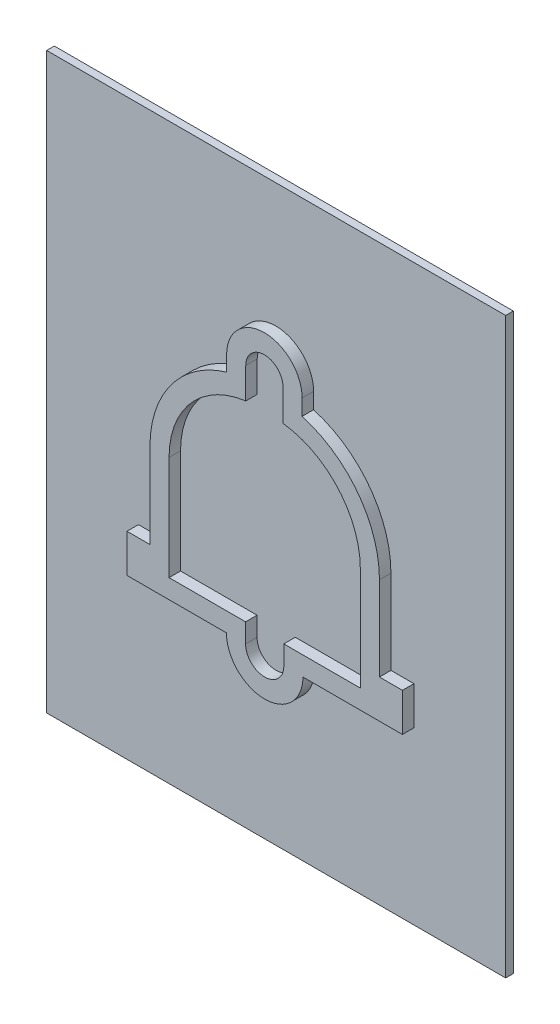
ISO-10303-21;
HEADER;
FILE_DESCRIPTION(('STEP AP214'),'2;1');
FILE_NAME('part.step','',(''),(''),'','','');
FILE_SCHEMA(('AUTOMOTIVE_DESIGN { 1 0 10303 214 1 1 1 1 }'));
ENDSEC;
DATA;
#1=APPLICATION_CONTEXT('core data for automotive mechanical design processes');
#2=APPLICATION_PROTOCOL_DEFINITION('international standard','automotive_design',2000,#1);
#3=PRODUCT_CONTEXT('',#1,'mechanical');
#4=PRODUCT('Part','Part','',(#3));
#5=PRODUCT_RELATED_PRODUCT_CATEGORY('part','',(#4));
#6=PRODUCT_DEFINITION_FORMATION('','',#4);
#7=PRODUCT_DEFINITION_CONTEXT('part definition',#1,'design');
#8=PRODUCT_DEFINITION('design','',#6,#7);
#9=PRODUCT_DEFINITION_SHAPE('','',#8);
#10=(LENGTH_UNIT() NAMED_UNIT(*) SI_UNIT(.MILLI.,.METRE.));
#11=(NAMED_UNIT(*) PLANE_ANGLE_UNIT() SI_UNIT($,.RADIAN.));
#12=(NAMED_UNIT(*) SI_UNIT($,.STERADIAN.) SOLID_ANGLE_UNIT());
#13=UNCERTAINTY_MEASURE_WITH_UNIT(LENGTH_MEASURE(1.E-05),#10,'distance_accuracy_value','');
#14=(GEOMETRIC_REPRESENTATION_CONTEXT(3) GLOBAL_UNCERTAINTY_ASSIGNED_CONTEXT((#13)) GLOBAL_UNIT_ASSIGNED_CONTEXT((#10,
#11,#12)) REPRESENTATION_CONTEXT('',''));
#15=CARTESIAN_POINT('',(0.,0.,0.));
#16=DIRECTION('',(0.,0.,1.));
#17=DIRECTION('',(1.,0.,0.));
#18=AXIS2_PLACEMENT_3D('',#15,#16,#17);
#19=CARTESIAN_POINT('',(-14.0104058623446,22.3529420123859,0.3));
#20=DIRECTION('',(0.,0.,-1.));
#21=DIRECTION('',(-1.,0.,0.));
#22=AXIS2_PLACEMENT_3D('',#19,#20,#21);
#23=PLANE('',#22);
#24=CARTESIAN_POINT('',(-14.0104058623446,22.3529420123859,0.3));
#25=DIRECTION('',(0.,0.,1.));
#26=DIRECTION('',(-1.,0.,0.));
#27=AXIS2_PLACEMENT_3D('',#24,#25,#26);
#28=CIRCLE('',#27,2.79999999999993);
#29=CARTESIAN_POINT('',(-14.8059769852625,25.0375400434473,0.3));
#30=VERTEX_POINT('',#29);
#31=CARTESIAN_POINT('',(-16.8104058623445,22.3529420123859,0.3));
#32=VERTEX_POINT('',#31);
#33=EDGE_CURVE('E57',#30,#32,#28,.T.);
#34=ORIENTED_EDGE('',*,*,#33,.T.);
#35=DIRECTION('',(0.,-1.,0.));
#36=VECTOR('',#35,1.);
#37=CARTESIAN_POINT('',(-16.8104058623445,22.3529420123859,0.3));
#38=LINE('',#37,#36);
#39=CARTESIAN_POINT('',(-16.8104058623445,20.131551421546,0.3));
#40=VERTEX_POINT('',#39);
#41=EDGE_CURVE('E403',#32,#40,#38,.T.);
#42=ORIENTED_EDGE('',*,*,#41,.T.);
#43=DIRECTION('',(-1.,0.,0.));
#44=VECTOR('',#43,1.);
#45=CARTESIAN_POINT('',(-16.8104058623445,20.131551421546,0.3));
#46=LINE('',#45,#44);
#47=CARTESIAN_POINT('',(-17.4104058623447,20.131551421546,0.3));
#48=VERTEX_POINT('',#47);
#49=EDGE_CURVE('E405',#40,#48,#46,.T.);
#50=ORIENTED_EDGE('',*,*,#49,.T.);
#51=DIRECTION('',(0.,-1.,0.));
#52=VECTOR('',#51,1.);
#53=CARTESIAN_POINT('',(-17.4104058623447,19.1315514215447,0.3));
#54=LINE('',#53,#52);
#55=CARTESIAN_POINT('',(-17.4104058623447,19.1315514215447,0.3));
#56=VERTEX_POINT('',#55);
#57=EDGE_CURVE('E407',#48,#56,#54,.T.);
#58=ORIENTED_EDGE('',*,*,#57,.T.);
#59=DIRECTION('',(1.,0.,0.));
#60=VECTOR('',#59,1.);
#61=CARTESIAN_POINT('',(-14.8104058623444,19.1315514215447,0.3));
#62=LINE('',#61,#60);
#63=CARTESIAN_POINT('',(-14.8104058623445,19.1315514215447,0.3));
#64=VERTEX_POINT('',#63);
#65=EDGE_CURVE('E409',#56,#64,#62,.T.);
#66=ORIENTED_EDGE('',*,*,#65,.T.);
#67=CARTESIAN_POINT('',(-13.8104058623445,19.1315514215446,0.3));
#68=DIRECTION('',(0.,0.,1.));
#69=DIRECTION('',(-1.,0.,0.));
#70=AXIS2_PLACEMENT_3D('',#67,#68,#69);
#71=CIRCLE('',#70,0.999999999999999);
#72=CARTESIAN_POINT('',(-12.8104058623444,19.1315514215453,0.3));
#73=VERTEX_POINT('',#72);
#74=EDGE_CURVE('E411',#64,#73,#71,.T.);
#75=ORIENTED_EDGE('',*,*,#74,.T.);
#76=DIRECTION('',(1.,0.,0.));
#77=VECTOR('',#76,1.);
#78=CARTESIAN_POINT('',(-10.2104058623447,19.1315514215453,0.3));
#79=LINE('',#78,#77);
#80=CARTESIAN_POINT('',(-10.2104058623447,19.1315514215453,0.3));
#81=VERTEX_POINT('',#80);
#82=EDGE_CURVE('E413',#73,#81,#79,.T.);
#83=ORIENTED_EDGE('',*,*,#82,.T.);
#84=DIRECTION('',(0.,1.,0.));
#85=VECTOR('',#84,1.);
#86=CARTESIAN_POINT('',(-10.2104058623447,19.1315514215453,0.3));
#87=LINE('',#86,#85);
#88=CARTESIAN_POINT('',(-10.2104058623447,20.131551421546,0.3));
#89=VERTEX_POINT('',#88);
#90=EDGE_CURVE('E415',#81,#89,#87,.T.);
#91=ORIENTED_EDGE('',*,*,#90,.T.);
#92=DIRECTION('',(-1.,1.27213054905061E-13,0.));
#93=VECTOR('',#92,1.);
#94=CARTESIAN_POINT('',(-10.2104058623447,20.131551421546,0.3));
#95=LINE('',#94,#93);
#96=CARTESIAN_POINT('',(-10.8104058623443,20.1315514215461,0.3));
#97=VERTEX_POINT('',#96);
#98=EDGE_CURVE('E417',#89,#97,#95,.T.);
#99=ORIENTED_EDGE('',*,*,#98,.T.);
#100=DIRECTION('',(0.,1.,0.));
#101=VECTOR('',#100,1.);
#102=CARTESIAN_POINT('',(-10.8104058623443,22.3315514215446,0.3));
#103=LINE('',#102,#101);
#104=CARTESIAN_POINT('',(-10.8104058623443,22.3315514215446,0.3));
#105=VERTEX_POINT('',#104);
#106=EDGE_CURVE('E419',#97,#105,#103,.T.);
#107=ORIENTED_EDGE('',*,*,#106,.T.);
#108=CARTESIAN_POINT('',(-13.6104058623441,22.3315514215446,0.3));
#109=DIRECTION('',(0.,0.,1.));
#110=DIRECTION('',(1.,0.,0.));
#111=AXIS2_PLACEMENT_3D('',#108,#109,#110);
#112=CIRCLE('',#111,2.79999999999987);
#113=CARTESIAN_POINT('',(-12.8328418132162,25.0214202193678,0.3));
#114=VERTEX_POINT('',#113);
#115=EDGE_CURVE('E421',#105,#114,#112,.T.);
#116=ORIENTED_EDGE('',*,*,#115,.T.);
#117=DIRECTION('',(0.,1.,0.));
#118=VECTOR('',#117,1.);
#119=CARTESIAN_POINT('',(-12.8328418132162,25.0214202193678,0.3));
#120=LINE('',#119,#118);
#121=CARTESIAN_POINT('',(-12.8328418132162,25.4375400434473,0.3));
#122=VERTEX_POINT('',#121);
#123=EDGE_CURVE('E423',#114,#122,#120,.T.);
#124=ORIENTED_EDGE('',*,*,#123,.T.);
#125=CARTESIAN_POINT('',(-13.8194093992394,25.4375400434473,0.3));
#126=DIRECTION('',(0.,0.,1.));
#127=DIRECTION('',(-1.,0.,0.));
#128=AXIS2_PLACEMENT_3D('',#125,#126,#127);
#129=CIRCLE('',#128,0.986567586023153);
#130=CARTESIAN_POINT('',(-14.8059769852625,25.4375400434473,0.3));
#131=VERTEX_POINT('',#130);
#132=EDGE_CURVE('E425',#122,#131,#129,.T.);
#133=ORIENTED_EDGE('',*,*,#132,.T.);
#134=DIRECTION('',(0.,-1.,0.));
#135=VECTOR('',#134,1.);
#136=CARTESIAN_POINT('',(-14.8059769852625,25.0375400434473,0.3));
#137=LINE('',#136,#135);
#138=EDGE_CURVE('E427',#131,#30,#137,.T.);
#139=ORIENTED_EDGE('',*,*,#138,.T.);
#140=EDGE_LOOP('',(#34,#42,#50,#58,#66,#75,#83,#91,#99,#107,#116,#124,#133,#139));
#141=FACE_BOUND('',#140,.T.);
#142=CARTESIAN_POINT('',(-13.6104058623441,22.3315514215446,0.3));
#143=DIRECTION('',(0.,0.,1.));
#144=DIRECTION('',(1.,0.,0.));
#145=AXIS2_PLACEMENT_3D('',#142,#143,#144);
#146=CIRCLE('',#145,2.29999999999994);
#147=CARTESIAN_POINT('',(-11.3104058623442,22.3315514215446,0.3));
#148=VERTEX_POINT('',#147);
#149=CARTESIAN_POINT('',(-13.3328418132162,24.6147417768657,0.3));
#150=VERTEX_POINT('',#149);
#151=EDGE_CURVE('E311',#148,#150,#146,.T.);
#152=ORIENTED_EDGE('',*,*,#151,.F.);
#153=DIRECTION('',(0.,1.,0.));
#154=VECTOR('',#153,1.);
#155=CARTESIAN_POINT('',(-11.3104058623442,22.3315514215446,0.3));
#156=LINE('',#155,#154);
#157=CARTESIAN_POINT('',(-11.3104058623442,19.6315514215453,0.3));
#158=VERTEX_POINT('',#157);
#159=EDGE_CURVE('E333',#158,#148,#156,.T.);
#160=ORIENTED_EDGE('',*,*,#159,.F.);
#161=DIRECTION('',(1.,0.,0.));
#162=VECTOR('',#161,1.);
#163=CARTESIAN_POINT('',(-11.3104058623442,19.6315514215453,0.3));
#164=LINE('',#163,#162);
#165=CARTESIAN_POINT('',(-13.3104058623445,19.6315514215453,0.3));
#166=VERTEX_POINT('',#165);
#167=EDGE_CURVE('E331',#166,#158,#164,.T.);
#168=ORIENTED_EDGE('',*,*,#167,.F.);
#169=DIRECTION('',(-2.25514051876647E-13,1.,0.));
#170=VECTOR('',#169,1.);
#171=CARTESIAN_POINT('',(-13.3104058623444,19.1315514215446,0.3));
#172=LINE('',#171,#170);
#173=CARTESIAN_POINT('',(-13.3104058623444,19.1315514215446,0.3));
#174=VERTEX_POINT('',#173);
#175=EDGE_CURVE('E329',#174,#166,#172,.T.);
#176=ORIENTED_EDGE('',*,*,#175,.F.);
#177=CARTESIAN_POINT('',(-13.8104058623445,19.1315514215446,0.3));
#178=DIRECTION('',(0.,0.,1.));
#179=DIRECTION('',(-1.,0.,0.));
#180=AXIS2_PLACEMENT_3D('',#177,#178,#179);
#181=CIRCLE('',#180,0.500000000000059);
#182=CARTESIAN_POINT('',(-14.3104058623446,19.1315514215446,0.3));
#183=VERTEX_POINT('',#182);
#184=EDGE_CURVE('E327',#183,#174,#181,.T.);
#185=ORIENTED_EDGE('',*,*,#184,.F.);
#186=DIRECTION('',(0.,-1.,0.));
#187=VECTOR('',#186,1.);
#188=CARTESIAN_POINT('',(-14.3104058623445,19.1315514215446,0.3));
#189=LINE('',#188,#187);
#190=CARTESIAN_POINT('',(-14.3104058623445,19.6315514215453,0.3));
#191=VERTEX_POINT('',#190);
#192=EDGE_CURVE('E325',#191,#183,#189,.T.);
#193=ORIENTED_EDGE('',*,*,#192,.F.);
#194=DIRECTION('',(1.,0.,0.));
#195=VECTOR('',#194,1.);
#196=CARTESIAN_POINT('',(-14.3104058623445,19.6315514215453,0.3));
#197=LINE('',#196,#195);
#198=CARTESIAN_POINT('',(-16.3104058623445,19.6315514215453,0.3));
#199=VERTEX_POINT('',#198);
#200=EDGE_CURVE('E323',#199,#191,#197,.T.);
#201=ORIENTED_EDGE('',*,*,#200,.F.);
#202=DIRECTION('',(0.,-1.,0.));
#203=VECTOR('',#202,1.);
#204=CARTESIAN_POINT('',(-16.3104058623445,22.3529420123859,0.3));
#205=LINE('',#204,#203);
#206=CARTESIAN_POINT('',(-16.3104058623445,22.3529420123859,0.3));
#207=VERTEX_POINT('',#206);
#208=EDGE_CURVE('E321',#207,#199,#205,.T.);
#209=ORIENTED_EDGE('',*,*,#208,.F.);
#210=CARTESIAN_POINT('',(-14.0104058623446,22.3529420123859,0.3));
#211=DIRECTION('',(0.,0.,1.));
#212=DIRECTION('',(-1.,0.,0.));
#213=AXIS2_PLACEMENT_3D('',#210,#211,#212);
#214=CIRCLE('',#213,2.29999999999995);
#215=CARTESIAN_POINT('',(-14.3059769852625,24.633871145721,0.3));
#216=VERTEX_POINT('',#215);
#217=EDGE_CURVE('E319',#216,#207,#214,.T.);
#218=ORIENTED_EDGE('',*,*,#217,.F.);
#219=DIRECTION('',(0.,-1.,0.));
#220=VECTOR('',#219,1.);
#221=CARTESIAN_POINT('',(-14.3059769852625,24.633871145721,0.3));
#222=LINE('',#221,#220);
#223=CARTESIAN_POINT('',(-14.3059769852625,25.4375400434473,0.3));
#224=VERTEX_POINT('',#223);
#225=EDGE_CURVE('E317',#224,#216,#222,.T.);
#226=ORIENTED_EDGE('',*,*,#225,.F.);
#227=CARTESIAN_POINT('',(-13.8194093992394,25.4375400434473,0.3));
#228=DIRECTION('',(0.,0.,1.));
#229=DIRECTION('',(-1.,0.,0.));
#230=AXIS2_PLACEMENT_3D('',#227,#228,#229);
#231=CIRCLE('',#230,0.486567586023158);
#232=CARTESIAN_POINT('',(-13.3328418132162,25.4375400434473,0.3));
#233=VERTEX_POINT('',#232);
#234=EDGE_CURVE('E315',#233,#224,#231,.T.);
#235=ORIENTED_EDGE('',*,*,#234,.F.);
#236=DIRECTION('',(0.,1.,0.));
#237=VECTOR('',#236,1.);
#238=CARTESIAN_POINT('',(-13.3328418132162,24.6147417768657,0.3));
#239=LINE('',#238,#237);
#240=EDGE_CURVE('E313',#150,#233,#239,.T.);
#241=ORIENTED_EDGE('',*,*,#240,.F.);
#242=EDGE_LOOP('',(#152,#160,#168,#176,#185,#193,#201,#209,#218,#226,#235,#241));
#243=FACE_BOUND('',#242,.T.);
#244=ADVANCED_FACE('F34',(#141,#243),#23,.F.);
#245=CARTESIAN_POINT('',(-16.8104058623445,22.3529420123859,0.3));
#246=DIRECTION('',(1.,0.,0.));
#247=DIRECTION('',(0.,1.,0.));
#248=AXIS2_PLACEMENT_3D('',#245,#246,#247);
#249=PLANE('',#248);
#250=DIRECTION('',(0.,-1.,0.));
#251=VECTOR('',#250,1.);
#252=CARTESIAN_POINT('',(-16.8104058623445,22.3529420123859,0.));
#253=LINE('',#252,#251);
#254=CARTESIAN_POINT('',(-16.8104058623445,22.3529420123859,0.));
#255=VERTEX_POINT('',#254);
#256=CARTESIAN_POINT('',(-16.8104058623445,20.131551421546,0.));
#257=VERTEX_POINT('',#256);
#258=EDGE_CURVE('E360',#255,#257,#253,.T.);
#259=ORIENTED_EDGE('',*,*,#258,.T.);
#260=DIRECTION('',(0.,0.,-1.));
#261=VECTOR('',#260,1.);
#262=CARTESIAN_POINT('',(-16.8104058623445,20.131551421546,0.3));
#263=LINE('',#262,#261);
#264=EDGE_CURVE('E42',#40,#257,#263,.T.);
#265=ORIENTED_EDGE('',*,*,#264,.F.);
#266=ORIENTED_EDGE('',*,*,#41,.F.);
#267=DIRECTION('',(0.,0.,-1.));
#268=VECTOR('',#267,1.);
#269=CARTESIAN_POINT('',(-16.8104058623445,22.3529420123859,0.3));
#270=LINE('',#269,#268);
#271=EDGE_CURVE('E11',#32,#255,#270,.T.);
#272=ORIENTED_EDGE('',*,*,#271,.T.);
#273=EDGE_LOOP('',(#259,#265,#266,#272));
#274=FACE_BOUND('',#273,.T.);
#275=ADVANCED_FACE('F36',(#274),#249,.F.);
#276=CARTESIAN_POINT('',(-16.8104058623445,20.131551421546,0.3));
#277=DIRECTION('',(0.,-1.,0.));
#278=DIRECTION('',(0.,0.,-1.));
#279=AXIS2_PLACEMENT_3D('',#276,#277,#278);
#280=PLANE('',#279);
#281=DIRECTION('',(-1.,0.,0.));
#282=VECTOR('',#281,1.);
#283=CARTESIAN_POINT('',(-16.8104058623445,20.131551421546,0.));
#284=LINE('',#283,#282);
#285=CARTESIAN_POINT('',(-17.4104058623447,20.131551421546,0.));
#286=VERTEX_POINT('',#285);
#287=EDGE_CURVE('E363',#257,#286,#284,.T.);
#288=ORIENTED_EDGE('',*,*,#287,.T.);
#289=DIRECTION('',(0.,0.,-1.));
#290=VECTOR('',#289,1.);
#291=CARTESIAN_POINT('',(-17.4104058623447,20.131551421546,0.3));
#292=LINE('',#291,#290);
#293=EDGE_CURVE('E461',#48,#286,#292,.T.);
#294=ORIENTED_EDGE('',*,*,#293,.F.);
#295=ORIENTED_EDGE('',*,*,#49,.F.);
#296=ORIENTED_EDGE('',*,*,#264,.T.);
#297=EDGE_LOOP('',(#288,#294,#295,#296));
#298=FACE_BOUND('',#297,.T.);
#299=ADVANCED_FACE('F467',(#298),#280,.F.);
#300=CARTESIAN_POINT('',(-17.4104058623447,19.1315514215447,0.3));
#301=DIRECTION('',(1.,0.,0.));
#302=DIRECTION('',(0.,0.,-1.));
#303=AXIS2_PLACEMENT_3D('',#300,#301,#302);
#304=PLANE('',#303);
#305=DIRECTION('',(0.,-1.,0.));
#306=VECTOR('',#305,1.);
#307=CARTESIAN_POINT('',(-17.4104058623447,19.1315514215447,0.));
#308=LINE('',#307,#306);
#309=CARTESIAN_POINT('',(-17.4104058623447,19.1315514215447,0.));
#310=VERTEX_POINT('',#309);
#311=EDGE_CURVE('E366',#286,#310,#308,.T.);
#312=ORIENTED_EDGE('',*,*,#311,.T.);
#313=DIRECTION('',(0.,0.,-1.));
#314=VECTOR('',#313,1.);
#315=CARTESIAN_POINT('',(-17.4104058623447,19.1315514215447,0.3));
#316=LINE('',#315,#314);
#317=EDGE_CURVE('E458',#56,#310,#316,.T.);
#318=ORIENTED_EDGE('',*,*,#317,.F.);
#319=ORIENTED_EDGE('',*,*,#57,.F.);
#320=ORIENTED_EDGE('',*,*,#293,.T.);
#321=EDGE_LOOP('',(#312,#318,#319,#320));
#322=FACE_BOUND('',#321,.T.);
#323=ADVANCED_FACE('F514',(#322),#304,.F.);
#324=CARTESIAN_POINT('',(-14.8104058623444,19.1315514215447,0.3));
#325=DIRECTION('',(0.,1.,0.));
#326=DIRECTION('',(0.,0.,1.));
#327=AXIS2_PLACEMENT_3D('',#324,#325,#326);
#328=PLANE('',#327);
#329=DIRECTION('',(1.,0.,0.));
#330=VECTOR('',#329,1.);
#331=CARTESIAN_POINT('',(-14.8104058623444,19.1315514215447,0.));
#332=LINE('',#331,#330);
#333=CARTESIAN_POINT('',(-14.8104058623445,19.1315514215447,0.));
#334=VERTEX_POINT('',#333);
#335=EDGE_CURVE('E369',#310,#334,#332,.T.);
#336=ORIENTED_EDGE('',*,*,#335,.T.);
#337=DIRECTION('',(0.,0.,-1.));
#338=VECTOR('',#337,1.);
#339=CARTESIAN_POINT('',(-14.8104058623445,19.1315514215447,0.3));
#340=LINE('',#339,#338);
#341=EDGE_CURVE('E455',#64,#334,#340,.T.);
#342=ORIENTED_EDGE('',*,*,#341,.F.);
#343=ORIENTED_EDGE('',*,*,#65,.F.);
#344=ORIENTED_EDGE('',*,*,#317,.T.);
#345=EDGE_LOOP('',(#336,#342,#343,#344));
#346=FACE_BOUND('',#345,.T.);
#347=ADVANCED_FACE('F509',(#346),#328,.F.);
#348=CARTESIAN_POINT('',(-13.8104058623445,19.1315514215446,0.3));
#349=DIRECTION('',(0.,0.,-1.));
#350=DIRECTION('',(-1.,0.,0.));
#351=AXIS2_PLACEMENT_3D('',#348,#349,#350);
#352=CYLINDRICAL_SURFACE('',#351,0.999999999999999);
#353=CARTESIAN_POINT('',(-13.8104058623445,19.1315514215446,0.));
#354=DIRECTION('',(0.,0.,1.));
#355=DIRECTION('',(-1.,0.,0.));
#356=AXIS2_PLACEMENT_3D('',#353,#354,#355);
#357=CIRCLE('',#356,0.999999999999999);
#358=CARTESIAN_POINT('',(-12.8104058623444,19.1315514215453,0.));
#359=VERTEX_POINT('',#358);
#360=EDGE_CURVE('E372',#334,#359,#357,.T.);
#361=ORIENTED_EDGE('',*,*,#360,.T.);
#362=DIRECTION('',(0.,0.,-1.));
#363=VECTOR('',#362,1.);
#364=CARTESIAN_POINT('',(-12.8104058623444,19.1315514215453,0.3));
#365=LINE('',#364,#363);
#366=EDGE_CURVE('E452',#73,#359,#365,.T.);
#367=ORIENTED_EDGE('',*,*,#366,.F.);
#368=ORIENTED_EDGE('',*,*,#74,.F.);
#369=ORIENTED_EDGE('',*,*,#341,.T.);
#370=EDGE_LOOP('',(#361,#367,#368,#369));
#371=FACE_BOUND('',#370,.T.);
#372=ADVANCED_FACE('F506',(#371),#352,.T.);
#373=CARTESIAN_POINT('',(-10.2104058623447,19.1315514215453,0.3));
#374=DIRECTION('',(0.,1.,0.));
#375=DIRECTION('',(0.,0.,1.));
#376=AXIS2_PLACEMENT_3D('',#373,#374,#375);
#377=PLANE('',#376);
#378=DIRECTION('',(1.,0.,0.));
#379=VECTOR('',#378,1.);
#380=CARTESIAN_POINT('',(-10.2104058623447,19.1315514215453,0.));
#381=LINE('',#380,#379);
#382=CARTESIAN_POINT('',(-10.2104058623447,19.1315514215453,0.));
#383=VERTEX_POINT('',#382);
#384=EDGE_CURVE('E375',#359,#383,#381,.T.);
#385=ORIENTED_EDGE('',*,*,#384,.T.);
#386=DIRECTION('',(0.,0.,-1.));
#387=VECTOR('',#386,1.);
#388=CARTESIAN_POINT('',(-10.2104058623447,19.1315514215453,0.3));
#389=LINE('',#388,#387);
#390=EDGE_CURVE('E449',#81,#383,#389,.T.);
#391=ORIENTED_EDGE('',*,*,#390,.F.);
#392=ORIENTED_EDGE('',*,*,#82,.F.);
#393=ORIENTED_EDGE('',*,*,#366,.T.);
#394=EDGE_LOOP('',(#385,#391,#392,#393));
#395=FACE_BOUND('',#394,.T.);
#396=ADVANCED_FACE('F501',(#395),#377,.F.);
#397=CARTESIAN_POINT('',(-10.2104058623447,19.1315514215453,0.3));
#398=DIRECTION('',(-1.,0.,0.));
#399=DIRECTION('',(0.,0.,1.));
#400=AXIS2_PLACEMENT_3D('',#397,#398,#399);
#401=PLANE('',#400);
#402=DIRECTION('',(0.,1.,0.));
#403=VECTOR('',#402,1.);
#404=CARTESIAN_POINT('',(-10.2104058623447,19.1315514215453,0.));
#405=LINE('',#404,#403);
#406=CARTESIAN_POINT('',(-10.2104058623447,20.131551421546,0.));
#407=VERTEX_POINT('',#406);
#408=EDGE_CURVE('E378',#383,#407,#405,.T.);
#409=ORIENTED_EDGE('',*,*,#408,.T.);
#410=DIRECTION('',(0.,0.,-1.));
#411=VECTOR('',#410,1.);
#412=CARTESIAN_POINT('',(-10.2104058623447,20.131551421546,0.3));
#413=LINE('',#412,#411);
#414=EDGE_CURVE('E446',#89,#407,#413,.T.);
#415=ORIENTED_EDGE('',*,*,#414,.F.);
#416=ORIENTED_EDGE('',*,*,#90,.F.);
#417=ORIENTED_EDGE('',*,*,#390,.T.);
#418=EDGE_LOOP('',(#409,#415,#416,#417));
#419=FACE_BOUND('',#418,.T.);
#420=ADVANCED_FACE('F498',(#419),#401,.F.);
#421=CARTESIAN_POINT('',(-10.2104058623447,20.131551421546,0.3));
#422=DIRECTION('',(-1.27213054905061E-13,-1.,0.));
#423=DIRECTION('',(1.,-1.27213054905061E-13,0.));
#424=AXIS2_PLACEMENT_3D('',#421,#422,#423);
#425=PLANE('',#424);
#426=DIRECTION('',(-1.,1.27213054905061E-13,0.));
#427=VECTOR('',#426,1.);
#428=CARTESIAN_POINT('',(-10.2104058623447,20.131551421546,0.));
#429=LINE('',#428,#427);
#430=CARTESIAN_POINT('',(-10.8104058623443,20.1315514215461,0.));
#431=VERTEX_POINT('',#430);
#432=EDGE_CURVE('E381',#407,#431,#429,.T.);
#433=ORIENTED_EDGE('',*,*,#432,.T.);
#434=DIRECTION('',(0.,0.,-1.));
#435=VECTOR('',#434,1.);
#436=CARTESIAN_POINT('',(-10.8104058623443,20.1315514215461,0.3));
#437=LINE('',#436,#435);
#438=EDGE_CURVE('E443',#97,#431,#437,.T.);
#439=ORIENTED_EDGE('',*,*,#438,.F.);
#440=ORIENTED_EDGE('',*,*,#98,.F.);
#441=ORIENTED_EDGE('',*,*,#414,.T.);
#442=EDGE_LOOP('',(#433,#439,#440,#441));
#443=FACE_BOUND('',#442,.T.);
#444=ADVANCED_FACE('F493',(#443),#425,.F.);
#445=CARTESIAN_POINT('',(-10.8104058623443,22.3315514215446,0.3));
#446=DIRECTION('',(-1.,0.,0.));
#447=DIRECTION('',(0.,0.,1.));
#448=AXIS2_PLACEMENT_3D('',#445,#446,#447);
#449=PLANE('',#448);
#450=DIRECTION('',(0.,1.,0.));
#451=VECTOR('',#450,1.);
#452=CARTESIAN_POINT('',(-10.8104058623443,22.3315514215446,0.));
#453=LINE('',#452,#451);
#454=CARTESIAN_POINT('',(-10.8104058623443,22.3315514215446,0.));
#455=VERTEX_POINT('',#454);
#456=EDGE_CURVE('E384',#431,#455,#453,.T.);
#457=ORIENTED_EDGE('',*,*,#456,.T.);
#458=DIRECTION('',(0.,0.,-1.));
#459=VECTOR('',#458,1.);
#460=CARTESIAN_POINT('',(-10.8104058623443,22.3315514215446,0.3));
#461=LINE('',#460,#459);
#462=EDGE_CURVE('E440',#105,#455,#461,.T.);
#463=ORIENTED_EDGE('',*,*,#462,.F.);
#464=ORIENTED_EDGE('',*,*,#106,.F.);
#465=ORIENTED_EDGE('',*,*,#438,.T.);
#466=EDGE_LOOP('',(#457,#463,#464,#465));
#467=FACE_BOUND('',#466,.T.);
#468=ADVANCED_FACE('F490',(#467),#449,.F.);
#469=CARTESIAN_POINT('',(-13.6104058623441,22.3315514215446,0.3));
#470=DIRECTION('',(0.,0.,-1.));
#471=DIRECTION('',(-1.,0.,0.));
#472=AXIS2_PLACEMENT_3D('',#469,#470,#471);
#473=CYLINDRICAL_SURFACE('',#472,2.79999999999987);
#474=CARTESIAN_POINT('',(-13.6104058623441,22.3315514215446,0.));
#475=DIRECTION('',(0.,0.,1.));
#476=DIRECTION('',(1.,0.,0.));
#477=AXIS2_PLACEMENT_3D('',#474,#475,#476);
#478=CIRCLE('',#477,2.79999999999987);
#479=CARTESIAN_POINT('',(-12.8328418132162,25.0214202193678,0.));
#480=VERTEX_POINT('',#479);
#481=EDGE_CURVE('E387',#455,#480,#478,.T.);
#482=ORIENTED_EDGE('',*,*,#481,.T.);
#483=DIRECTION('',(0.,0.,-1.));
#484=VECTOR('',#483,1.);
#485=CARTESIAN_POINT('',(-12.8328418132162,25.0214202193678,0.3));
#486=LINE('',#485,#484);
#487=EDGE_CURVE('E437',#114,#480,#486,.T.);
#488=ORIENTED_EDGE('',*,*,#487,.F.);
#489=ORIENTED_EDGE('',*,*,#115,.F.);
#490=ORIENTED_EDGE('',*,*,#462,.T.);
#491=EDGE_LOOP('',(#482,#488,#489,#490));
#492=FACE_BOUND('',#491,.T.);
#493=ADVANCED_FACE('F485',(#492),#473,.T.);
#494=CARTESIAN_POINT('',(-12.8328418132162,25.0214202193678,0.3));
#495=DIRECTION('',(-1.,0.,0.));
#496=DIRECTION('',(0.,0.,1.));
#497=AXIS2_PLACEMENT_3D('',#494,#495,#496);
#498=PLANE('',#497);
#499=DIRECTION('',(0.,1.,0.));
#500=VECTOR('',#499,1.);
#501=CARTESIAN_POINT('',(-12.8328418132162,25.0214202193678,0.));
#502=LINE('',#501,#500);
#503=CARTESIAN_POINT('',(-12.8328418132162,25.4375400434473,0.));
#504=VERTEX_POINT('',#503);
#505=EDGE_CURVE('E390',#480,#504,#502,.T.);
#506=ORIENTED_EDGE('',*,*,#505,.T.);
#507=DIRECTION('',(0.,0.,-1.));
#508=VECTOR('',#507,1.);
#509=CARTESIAN_POINT('',(-12.8328418132162,25.4375400434473,0.3));
#510=LINE('',#509,#508);
#511=EDGE_CURVE('E434',#122,#504,#510,.T.);
#512=ORIENTED_EDGE('',*,*,#511,.F.);
#513=ORIENTED_EDGE('',*,*,#123,.F.);
#514=ORIENTED_EDGE('',*,*,#487,.T.);
#515=EDGE_LOOP('',(#506,#512,#513,#514));
#516=FACE_BOUND('',#515,.T.);
#517=ADVANCED_FACE('F482',(#516),#498,.F.);
#518=CARTESIAN_POINT('',(-13.8194093992394,25.4375400434473,0.3));
#519=DIRECTION('',(0.,0.,-1.));
#520=DIRECTION('',(-1.,0.,0.));
#521=AXIS2_PLACEMENT_3D('',#518,#519,#520);
#522=CYLINDRICAL_SURFACE('',#521,0.986567586023153);
#523=CARTESIAN_POINT('',(-13.8194093992394,25.4375400434473,0.));
#524=DIRECTION('',(0.,0.,1.));
#525=DIRECTION('',(-1.,0.,0.));
#526=AXIS2_PLACEMENT_3D('',#523,#524,#525);
#527=CIRCLE('',#526,0.986567586023153);
#528=CARTESIAN_POINT('',(-14.8059769852625,25.4375400434473,0.));
#529=VERTEX_POINT('',#528);
#530=EDGE_CURVE('E393',#504,#529,#527,.T.);
#531=ORIENTED_EDGE('',*,*,#530,.T.);
#532=DIRECTION('',(0.,0.,-1.));
#533=VECTOR('',#532,1.);
#534=CARTESIAN_POINT('',(-14.8059769852625,25.4375400434473,0.3));
#535=LINE('',#534,#533);
#536=EDGE_CURVE('E431',#131,#529,#535,.T.);
#537=ORIENTED_EDGE('',*,*,#536,.F.);
#538=ORIENTED_EDGE('',*,*,#132,.F.);
#539=ORIENTED_EDGE('',*,*,#511,.T.);
#540=EDGE_LOOP('',(#531,#537,#538,#539));
#541=FACE_BOUND('',#540,.T.);
#542=ADVANCED_FACE('F477',(#541),#522,.T.);
#543=CARTESIAN_POINT('',(-14.8059769852625,25.0375400434473,0.3));
#544=DIRECTION('',(1.,0.,0.));
#545=DIRECTION('',(0.,1.,0.));
#546=AXIS2_PLACEMENT_3D('',#543,#544,#545);
#547=PLANE('',#546);
#548=DIRECTION('',(0.,-1.,0.));
#549=VECTOR('',#548,1.);
#550=CARTESIAN_POINT('',(-14.8059769852625,25.0375400434473,0.));
#551=LINE('',#550,#549);
#552=CARTESIAN_POINT('',(-14.8059769852625,25.0375400434473,0.));
#553=VERTEX_POINT('',#552);
#554=EDGE_CURVE('E396',#529,#553,#551,.T.);
#555=ORIENTED_EDGE('',*,*,#554,.T.);
#556=DIRECTION('',(0.,0.,-1.));
#557=VECTOR('',#556,1.);
#558=CARTESIAN_POINT('',(-14.8059769852625,25.0375400434473,0.3));
#559=LINE('',#558,#557);
#560=EDGE_CURVE('E429',#30,#553,#559,.T.);
#561=ORIENTED_EDGE('',*,*,#560,.F.);
#562=ORIENTED_EDGE('',*,*,#138,.F.);
#563=ORIENTED_EDGE('',*,*,#536,.T.);
#564=EDGE_LOOP('',(#555,#561,#562,#563));
#565=FACE_BOUND('',#564,.T.);
#566=ADVANCED_FACE('F474',(#565),#547,.F.);
#567=CARTESIAN_POINT('',(-14.0104058623446,22.3529420123859,0.3));
#568=DIRECTION('',(0.,0.,-1.));
#569=DIRECTION('',(-1.,0.,0.));
#570=AXIS2_PLACEMENT_3D('',#567,#568,#569);
#571=CYLINDRICAL_SURFACE('',#570,2.79999999999994);
#572=CARTESIAN_POINT('',(-14.0104058623446,22.3529420123859,0.));
#573=DIRECTION('',(0.,0.,1.));
#574=DIRECTION('',(-1.,0.,0.));
#575=AXIS2_PLACEMENT_3D('',#572,#573,#574);
#576=CIRCLE('',#575,2.79999999999994);
#577=EDGE_CURVE('E399',#553,#255,#576,.T.);
#578=ORIENTED_EDGE('',*,*,#577,.T.);
#579=ORIENTED_EDGE('',*,*,#271,.F.);
#580=ORIENTED_EDGE('',*,*,#33,.F.);
#581=ORIENTED_EDGE('',*,*,#560,.T.);
#582=EDGE_LOOP('',(#578,#579,#580,#581));
#583=FACE_BOUND('',#582,.T.);
#584=ADVANCED_FACE('F470',(#583),#571,.T.);
#585=CARTESIAN_POINT('',(-13.6104058623441,22.3315514215446,0.3));
#586=DIRECTION('',(0.,0.,-1.));
#587=DIRECTION('',(-1.,0.,0.));
#588=AXIS2_PLACEMENT_3D('',#585,#586,#587);
#589=CYLINDRICAL_SURFACE('',#588,2.29999999999994);
#590=CARTESIAN_POINT('',(-13.6104058623441,22.3315514215446,0.));
#591=DIRECTION('',(0.,0.,1.));
#592=DIRECTION('',(1.,0.,0.));
#593=AXIS2_PLACEMENT_3D('',#590,#591,#592);
#594=CIRCLE('',#593,2.29999999999994);
#595=CARTESIAN_POINT('',(-11.3104058623442,22.3315514215446,0.));
#596=VERTEX_POINT('',#595);
#597=CARTESIAN_POINT('',(-13.3328418132162,24.6147417768657,0.));
#598=VERTEX_POINT('',#597);
#599=EDGE_CURVE('E252',#596,#598,#594,.T.);
#600=ORIENTED_EDGE('',*,*,#599,.F.);
#601=DIRECTION('',(0.,0.,-1.));
#602=VECTOR('',#601,1.);
#603=CARTESIAN_POINT('',(-11.3104058623442,22.3315514215446,0.3));
#604=LINE('',#603,#602);
#605=EDGE_CURVE('E335',#148,#596,#604,.T.);
#606=ORIENTED_EDGE('',*,*,#605,.F.);
#607=ORIENTED_EDGE('',*,*,#151,.T.);
#608=DIRECTION('',(0.,0.,-1.));
#609=VECTOR('',#608,1.);
#610=CARTESIAN_POINT('',(-13.3328418132162,24.6147417768657,0.3));
#611=LINE('',#610,#609);
#612=EDGE_CURVE('E357',#150,#598,#611,.T.);
#613=ORIENTED_EDGE('',*,*,#612,.T.);
#614=EDGE_LOOP('',(#600,#606,#607,#613));
#615=FACE_BOUND('',#614,.T.);
#616=ADVANCED_FACE('F528',(#615),#589,.F.);
#617=CARTESIAN_POINT('',(-13.3328418132162,24.6147417768657,0.3));
#618=DIRECTION('',(-1.,0.,0.));
#619=DIRECTION('',(0.,-1.,0.));
#620=AXIS2_PLACEMENT_3D('',#617,#618,#619);
#621=PLANE('',#620);
#622=DIRECTION('',(0.,1.,0.));
#623=VECTOR('',#622,1.);
#624=CARTESIAN_POINT('',(-13.3328418132162,24.6147417768657,0.));
#625=LINE('',#624,#623);
#626=CARTESIAN_POINT('',(-13.3328418132162,25.4375400434473,0.));
#627=VERTEX_POINT('',#626);
#628=EDGE_CURVE('E278',#598,#627,#625,.T.);
#629=ORIENTED_EDGE('',*,*,#628,.F.);
#630=ORIENTED_EDGE('',*,*,#612,.F.);
#631=ORIENTED_EDGE('',*,*,#240,.T.);
#632=DIRECTION('',(0.,0.,-1.));
#633=VECTOR('',#632,1.);
#634=CARTESIAN_POINT('',(-13.3328418132162,25.4375400434473,0.3));
#635=LINE('',#634,#633);
#636=EDGE_CURVE('E355',#233,#627,#635,.T.);
#637=ORIENTED_EDGE('',*,*,#636,.T.);
#638=EDGE_LOOP('',(#629,#630,#631,#637));
#639=FACE_BOUND('',#638,.T.);
#640=ADVANCED_FACE('F530',(#639),#621,.T.);
#641=CARTESIAN_POINT('',(-13.8194093992394,25.4375400434473,0.3));
#642=DIRECTION('',(0.,0.,-1.));
#643=DIRECTION('',(-1.,0.,0.));
#644=AXIS2_PLACEMENT_3D('',#641,#642,#643);
#645=CYLINDRICAL_SURFACE('',#644,0.486567586023158);
#646=CARTESIAN_POINT('',(-13.8194093992394,25.4375400434473,0.));
#647=DIRECTION('',(0.,0.,1.));
#648=DIRECTION('',(-1.,0.,0.));
#649=AXIS2_PLACEMENT_3D('',#646,#647,#648);
#650=CIRCLE('',#649,0.486567586023158);
#651=CARTESIAN_POINT('',(-14.3059769852625,25.4375400434473,0.));
#652=VERTEX_POINT('',#651);
#653=EDGE_CURVE('E281',#627,#652,#650,.T.);
#654=ORIENTED_EDGE('',*,*,#653,.F.);
#655=ORIENTED_EDGE('',*,*,#636,.F.);
#656=ORIENTED_EDGE('',*,*,#234,.T.);
#657=DIRECTION('',(0.,0.,-1.));
#658=VECTOR('',#657,1.);
#659=CARTESIAN_POINT('',(-14.3059769852625,25.4375400434473,0.3));
#660=LINE('',#659,#658);
#661=EDGE_CURVE('E353',#224,#652,#660,.T.);
#662=ORIENTED_EDGE('',*,*,#661,.T.);
#663=EDGE_LOOP('',(#654,#655,#656,#662));
#664=FACE_BOUND('',#663,.T.);
#665=ADVANCED_FACE('F577',(#664),#645,.F.);
#666=CARTESIAN_POINT('',(-14.3059769852625,24.633871145721,0.3));
#667=DIRECTION('',(1.,0.,0.));
#668=DIRECTION('',(0.,1.,0.));
#669=AXIS2_PLACEMENT_3D('',#666,#667,#668);
#670=PLANE('',#669);
#671=DIRECTION('',(0.,-1.,0.));
#672=VECTOR('',#671,1.);
#673=CARTESIAN_POINT('',(-14.3059769852625,24.633871145721,0.));
#674=LINE('',#673,#672);
#675=CARTESIAN_POINT('',(-14.3059769852625,24.633871145721,0.));
#676=VERTEX_POINT('',#675);
#677=EDGE_CURVE('E284',#652,#676,#674,.T.);
#678=ORIENTED_EDGE('',*,*,#677,.F.);
#679=ORIENTED_EDGE('',*,*,#661,.F.);
#680=ORIENTED_EDGE('',*,*,#225,.T.);
#681=DIRECTION('',(0.,0.,-1.));
#682=VECTOR('',#681,1.);
#683=CARTESIAN_POINT('',(-14.3059769852625,24.633871145721,0.3));
#684=LINE('',#683,#682);
#685=EDGE_CURVE('E350',#216,#676,#684,.T.);
#686=ORIENTED_EDGE('',*,*,#685,.T.);
#687=EDGE_LOOP('',(#678,#679,#680,#686));
#688=FACE_BOUND('',#687,.T.);
#689=ADVANCED_FACE('F573',(#688),#670,.T.);
#690=CARTESIAN_POINT('',(-14.0104058623446,22.3529420123859,0.3));
#691=DIRECTION('',(0.,0.,-1.));
#692=DIRECTION('',(-1.,0.,0.));
#693=AXIS2_PLACEMENT_3D('',#690,#691,#692);
#694=CYLINDRICAL_SURFACE('',#693,2.29999999999993);
#695=CARTESIAN_POINT('',(-14.0104058623446,22.3529420123859,0.));
#696=DIRECTION('',(0.,0.,1.));
#697=DIRECTION('',(-1.,0.,0.));
#698=AXIS2_PLACEMENT_3D('',#695,#696,#697);
#699=CIRCLE('',#698,2.29999999999993);
#700=CARTESIAN_POINT('',(-16.3104058623445,22.3529420123859,0.));
#701=VERTEX_POINT('',#700);
#702=EDGE_CURVE('E287',#676,#701,#699,.T.);
#703=ORIENTED_EDGE('',*,*,#702,.F.);
#704=ORIENTED_EDGE('',*,*,#685,.F.);
#705=ORIENTED_EDGE('',*,*,#217,.T.);
#706=DIRECTION('',(0.,0.,-1.));
#707=VECTOR('',#706,1.);
#708=CARTESIAN_POINT('',(-16.3104058623445,22.3529420123859,0.3));
#709=LINE('',#708,#707);
#710=EDGE_CURVE('E348',#207,#701,#709,.T.);
#711=ORIENTED_EDGE('',*,*,#710,.T.);
#712=EDGE_LOOP('',(#703,#704,#705,#711));
#713=FACE_BOUND('',#712,.T.);
#714=ADVANCED_FACE('F569',(#713),#694,.F.);
#715=CARTESIAN_POINT('',(-16.3104058623445,22.3529420123859,0.3));
#716=DIRECTION('',(1.,0.,0.));
#717=DIRECTION('',(0.,1.,0.));
#718=AXIS2_PLACEMENT_3D('',#715,#716,#717);
#719=PLANE('',#718);
#720=DIRECTION('',(0.,-1.,0.));
#721=VECTOR('',#720,1.);
#722=CARTESIAN_POINT('',(-16.3104058623445,22.3529420123859,0.));
#723=LINE('',#722,#721);
#724=CARTESIAN_POINT('',(-16.3104058623445,19.6315514215453,0.));
#725=VERTEX_POINT('',#724);
#726=EDGE_CURVE('E290',#701,#725,#723,.T.);
#727=ORIENTED_EDGE('',*,*,#726,.F.);
#728=ORIENTED_EDGE('',*,*,#710,.F.);
#729=ORIENTED_EDGE('',*,*,#208,.T.);
#730=DIRECTION('',(0.,0.,-1.));
#731=VECTOR('',#730,1.);
#732=CARTESIAN_POINT('',(-16.3104058623445,19.6315514215453,0.3));
#733=LINE('',#732,#731);
#734=EDGE_CURVE('E346',#199,#725,#733,.T.);
#735=ORIENTED_EDGE('',*,*,#734,.T.);
#736=EDGE_LOOP('',(#727,#728,#729,#735));
#737=FACE_BOUND('',#736,.T.);
#738=ADVANCED_FACE('F565',(#737),#719,.T.);
#739=CARTESIAN_POINT('',(-14.3104058623445,19.6315514215453,0.3));
#740=DIRECTION('',(0.,1.,0.));
#741=DIRECTION('',(-1.,0.,0.));
#742=AXIS2_PLACEMENT_3D('',#739,#740,#741);
#743=PLANE('',#742);
#744=DIRECTION('',(1.,0.,0.));
#745=VECTOR('',#744,1.);
#746=CARTESIAN_POINT('',(-14.3104058623445,19.6315514215453,0.));
#747=LINE('',#746,#745);
#748=CARTESIAN_POINT('',(-14.3104058623445,19.6315514215453,0.));
#749=VERTEX_POINT('',#748);
#750=EDGE_CURVE('E293',#725,#749,#747,.T.);
#751=ORIENTED_EDGE('',*,*,#750,.F.);
#752=ORIENTED_EDGE('',*,*,#734,.F.);
#753=ORIENTED_EDGE('',*,*,#200,.T.);
#754=DIRECTION('',(0.,0.,-1.));
#755=VECTOR('',#754,1.);
#756=CARTESIAN_POINT('',(-14.3104058623445,19.6315514215453,0.3));
#757=LINE('',#756,#755);
#758=EDGE_CURVE('E344',#191,#749,#757,.T.);
#759=ORIENTED_EDGE('',*,*,#758,.T.);
#760=EDGE_LOOP('',(#751,#752,#753,#759));
#761=FACE_BOUND('',#760,.T.);
#762=ADVANCED_FACE('F561',(#761),#743,.T.);
#763=CARTESIAN_POINT('',(-14.3104058623445,19.1315514215446,0.3));
#764=DIRECTION('',(1.,0.,0.));
#765=DIRECTION('',(0.,0.,-1.));
#766=AXIS2_PLACEMENT_3D('',#763,#764,#765);
#767=PLANE('',#766);
#768=DIRECTION('',(0.,-1.,0.));
#769=VECTOR('',#768,1.);
#770=CARTESIAN_POINT('',(-14.3104058623445,19.1315514215446,0.));
#771=LINE('',#770,#769);
#772=CARTESIAN_POINT('',(-14.3104058623446,19.1315514215446,0.));
#773=VERTEX_POINT('',#772);
#774=EDGE_CURVE('E296',#749,#773,#771,.T.);
#775=ORIENTED_EDGE('',*,*,#774,.F.);
#776=ORIENTED_EDGE('',*,*,#758,.F.);
#777=ORIENTED_EDGE('',*,*,#192,.T.);
#778=DIRECTION('',(0.,0.,-1.));
#779=VECTOR('',#778,1.);
#780=CARTESIAN_POINT('',(-14.3104058623446,19.1315514215446,0.3));
#781=LINE('',#780,#779);
#782=EDGE_CURVE('E342',#183,#773,#781,.T.);
#783=ORIENTED_EDGE('',*,*,#782,.T.);
#784=EDGE_LOOP('',(#775,#776,#777,#783));
#785=FACE_BOUND('',#784,.T.);
#786=ADVANCED_FACE('F557',(#785),#767,.T.);
#787=CARTESIAN_POINT('',(-13.8104058623445,19.1315514215446,0.3));
#788=DIRECTION('',(0.,0.,-1.));
#789=DIRECTION('',(-1.,0.,0.));
#790=AXIS2_PLACEMENT_3D('',#787,#788,#789);
#791=CYLINDRICAL_SURFACE('',#790,0.500000000000059);
#792=CARTESIAN_POINT('',(-13.8104058623445,19.1315514215446,0.));
#793=DIRECTION('',(0.,0.,1.));
#794=DIRECTION('',(-1.,0.,0.));
#795=AXIS2_PLACEMENT_3D('',#792,#793,#794);
#796=CIRCLE('',#795,0.500000000000059);
#797=CARTESIAN_POINT('',(-13.3104058623444,19.1315514215446,0.));
#798=VERTEX_POINT('',#797);
#799=EDGE_CURVE('E299',#773,#798,#796,.T.);
#800=ORIENTED_EDGE('',*,*,#799,.F.);
#801=ORIENTED_EDGE('',*,*,#782,.F.);
#802=ORIENTED_EDGE('',*,*,#184,.T.);
#803=DIRECTION('',(0.,0.,-1.));
#804=VECTOR('',#803,1.);
#805=CARTESIAN_POINT('',(-13.3104058623444,19.1315514215446,0.3));
#806=LINE('',#805,#804);
#807=EDGE_CURVE('E340',#174,#798,#806,.T.);
#808=ORIENTED_EDGE('',*,*,#807,.T.);
#809=EDGE_LOOP('',(#800,#801,#802,#808));
#810=FACE_BOUND('',#809,.T.);
#811=ADVANCED_FACE('F553',(#810),#791,.F.);
#812=CARTESIAN_POINT('',(-13.3104058623444,19.1315514215446,0.3));
#813=DIRECTION('',(-1.,-2.25514051876647E-13,0.));
#814=DIRECTION('',(2.25514051876647E-13,-1.,0.));
#815=AXIS2_PLACEMENT_3D('',#812,#813,#814);
#816=PLANE('',#815);
#817=DIRECTION('',(-2.25514051876647E-13,1.,0.));
#818=VECTOR('',#817,1.);
#819=CARTESIAN_POINT('',(-13.3104058623444,19.1315514215446,0.));
#820=LINE('',#819,#818);
#821=CARTESIAN_POINT('',(-13.3104058623445,19.6315514215453,0.));
#822=VERTEX_POINT('',#821);
#823=EDGE_CURVE('E302',#798,#822,#820,.T.);
#824=ORIENTED_EDGE('',*,*,#823,.F.);
#825=ORIENTED_EDGE('',*,*,#807,.F.);
#826=ORIENTED_EDGE('',*,*,#175,.T.);
#827=DIRECTION('',(0.,0.,-1.));
#828=VECTOR('',#827,1.);
#829=CARTESIAN_POINT('',(-13.3104058623445,19.6315514215453,0.3));
#830=LINE('',#829,#828);
#831=EDGE_CURVE('E338',#166,#822,#830,.T.);
#832=ORIENTED_EDGE('',*,*,#831,.T.);
#833=EDGE_LOOP('',(#824,#825,#826,#832));
#834=FACE_BOUND('',#833,.T.);
#835=ADVANCED_FACE('F545',(#834),#816,.T.);
#836=CARTESIAN_POINT('',(-11.3104058623442,19.6315514215453,0.3));
#837=DIRECTION('',(0.,1.,0.));
#838=DIRECTION('',(-1.,0.,0.));
#839=AXIS2_PLACEMENT_3D('',#836,#837,#838);
#840=PLANE('',#839);
#841=DIRECTION('',(1.,0.,0.));
#842=VECTOR('',#841,1.);
#843=CARTESIAN_POINT('',(-11.3104058623442,19.6315514215453,0.));
#844=LINE('',#843,#842);
#845=CARTESIAN_POINT('',(-11.3104058623442,19.6315514215453,0.));
#846=VERTEX_POINT('',#845);
#847=EDGE_CURVE('E305',#822,#846,#844,.T.);
#848=ORIENTED_EDGE('',*,*,#847,.F.);
#849=ORIENTED_EDGE('',*,*,#831,.F.);
#850=ORIENTED_EDGE('',*,*,#167,.T.);
#851=DIRECTION('',(0.,0.,-1.));
#852=VECTOR('',#851,1.);
#853=CARTESIAN_POINT('',(-11.3104058623442,19.6315514215453,0.3));
#854=LINE('',#853,#852);
#855=EDGE_CURVE('E49',#158,#846,#854,.T.);
#856=ORIENTED_EDGE('',*,*,#855,.T.);
#857=EDGE_LOOP('',(#848,#849,#850,#856));
#858=FACE_BOUND('',#857,.T.);
#859=ADVANCED_FACE('F538',(#858),#840,.T.);
#860=CARTESIAN_POINT('',(-11.3104058623442,22.3315514215446,0.3));
#861=DIRECTION('',(-1.,0.,0.));
#862=DIRECTION('',(0.,0.,1.));
#863=AXIS2_PLACEMENT_3D('',#860,#861,#862);
#864=PLANE('',#863);
#865=DIRECTION('',(0.,1.,0.));
#866=VECTOR('',#865,1.);
#867=CARTESIAN_POINT('',(-11.3104058623442,22.3315514215446,0.));
#868=LINE('',#867,#866);
#869=EDGE_CURVE('E308',#846,#596,#868,.T.);
#870=ORIENTED_EDGE('',*,*,#869,.F.);
#871=ORIENTED_EDGE('',*,*,#855,.F.);
#872=ORIENTED_EDGE('',*,*,#159,.T.);
#873=ORIENTED_EDGE('',*,*,#605,.T.);
#874=EDGE_LOOP('',(#870,#871,#872,#873));
#875=FACE_BOUND('',#874,.T.);
#876=ADVANCED_FACE('F536',(#875),#864,.T.);
#877=CARTESIAN_POINT('',(-19.8104058623445,29.6677301350195,0.));
#878=DIRECTION('',(0.,0.,1.));
#879=DIRECTION('',(1.,0.,0.));
#880=AXIS2_PLACEMENT_3D('',#877,#878,#879);
#881=PLANE('',#880);
#882=ORIENTED_EDGE('',*,*,#869,.T.);
#883=ORIENTED_EDGE('',*,*,#599,.T.);
#884=ORIENTED_EDGE('',*,*,#628,.T.);
#885=ORIENTED_EDGE('',*,*,#653,.T.);
#886=ORIENTED_EDGE('',*,*,#677,.T.);
#887=ORIENTED_EDGE('',*,*,#702,.T.);
#888=ORIENTED_EDGE('',*,*,#726,.T.);
#889=ORIENTED_EDGE('',*,*,#750,.T.);
#890=ORIENTED_EDGE('',*,*,#774,.T.);
#891=ORIENTED_EDGE('',*,*,#799,.T.);
#892=ORIENTED_EDGE('',*,*,#823,.T.);
#893=ORIENTED_EDGE('',*,*,#847,.T.);
#894=EDGE_LOOP('',(#882,#883,#884,#885,#886,#887,#888,#889,#890,#891,#892,#893));
#895=FACE_BOUND('',#894,.T.);
#896=ADVANCED_FACE('F534',(#895),#881,.T.);
#897=DIRECTION('',(1.,0.,0.));
#898=VECTOR('',#897,1.);
#899=CARTESIAN_POINT('',(-7.81040586234449,29.6677301350195,0.));
#900=LINE('',#899,#898);
#901=CARTESIAN_POINT('',(-19.8104058623445,29.6677301350195,0.));
#902=VERTEX_POINT('',#901);
#903=CARTESIAN_POINT('',(-7.81040586234449,29.6677301350195,0.));
#904=VERTEX_POINT('',#903);
#905=EDGE_CURVE('E239',#902,#904,#900,.T.);
#906=ORIENTED_EDGE('',*,*,#905,.F.);
#907=DIRECTION('',(0.,1.,0.));
#908=VECTOR('',#907,1.);
#909=CARTESIAN_POINT('',(-19.8104058623445,29.6677301350195,0.));
#910=LINE('',#909,#908);
#911=CARTESIAN_POINT('',(-19.8104058623445,14.6677301350195,0.));
#912=VERTEX_POINT('',#911);
#913=EDGE_CURVE('E262',#912,#902,#910,.T.);
#914=ORIENTED_EDGE('',*,*,#913,.F.);
#915=DIRECTION('',(-1.,0.,0.));
#916=VECTOR('',#915,1.);
#917=CARTESIAN_POINT('',(-7.81040586234449,14.6677301350195,0.));
#918=LINE('',#917,#916);
#919=CARTESIAN_POINT('',(-7.81040586234449,14.6677301350195,0.));
#920=VERTEX_POINT('',#919);
#921=EDGE_CURVE('E240',#920,#912,#918,.T.);
#922=ORIENTED_EDGE('',*,*,#921,.F.);
#923=DIRECTION('',(0.,-1.,0.));
#924=VECTOR('',#923,1.);
#925=CARTESIAN_POINT('',(-7.81040586234449,29.6677301350195,0.));
#926=LINE('',#925,#924);
#927=EDGE_CURVE('E233',#904,#920,#926,.T.);
#928=ORIENTED_EDGE('',*,*,#927,.F.);
#929=EDGE_LOOP('',(#906,#914,#922,#928));
#930=FACE_BOUND('',#929,.T.);
#931=ORIENTED_EDGE('',*,*,#258,.F.);
#932=ORIENTED_EDGE('',*,*,#577,.F.);
#933=ORIENTED_EDGE('',*,*,#554,.F.);
#934=ORIENTED_EDGE('',*,*,#530,.F.);
#935=ORIENTED_EDGE('',*,*,#505,.F.);
#936=ORIENTED_EDGE('',*,*,#481,.F.);
#937=ORIENTED_EDGE('',*,*,#456,.F.);
#938=ORIENTED_EDGE('',*,*,#432,.F.);
#939=ORIENTED_EDGE('',*,*,#408,.F.);
#940=ORIENTED_EDGE('',*,*,#384,.F.);
#941=ORIENTED_EDGE('',*,*,#360,.F.);
#942=ORIENTED_EDGE('',*,*,#335,.F.);
#943=ORIENTED_EDGE('',*,*,#311,.F.);
#944=ORIENTED_EDGE('',*,*,#287,.F.);
#945=EDGE_LOOP('',(#931,#932,#933,#934,#935,#936,#937,#938,#939,#940,#941,#942,#943,#944));
#946=FACE_BOUND('',#945,.T.);
#947=ADVANCED_FACE('F235',(#930,#946),#881,.T.);
#948=CARTESIAN_POINT('',(-7.81040586234449,29.6677301350195,-0.2));
#949=DIRECTION('',(0.,-1.,0.));
#950=DIRECTION('',(0.,0.,-1.));
#951=AXIS2_PLACEMENT_3D('',#948,#949,#950);
#952=PLANE('',#951);
#953=ORIENTED_EDGE('',*,*,#905,.T.);
#954=DIRECTION('',(0.,0.,1.));
#955=VECTOR('',#954,1.);
#956=CARTESIAN_POINT('',(-7.81040586234449,29.6677301350195,-0.2));
#957=LINE('',#956,#955);
#958=CARTESIAN_POINT('',(-7.81040586234449,29.6677301350195,-0.2));
#959=VERTEX_POINT('',#958);
#960=EDGE_CURVE('E246',#959,#904,#957,.T.);
#961=ORIENTED_EDGE('',*,*,#960,.F.);
#962=DIRECTION('',(1.,0.,0.));
#963=VECTOR('',#962,1.);
#964=CARTESIAN_POINT('',(-7.81040586234449,29.6677301350195,-0.2));
#965=LINE('',#964,#963);
#966=CARTESIAN_POINT('',(-19.8104058623445,29.6677301350195,-0.2));
#967=VERTEX_POINT('',#966);
#968=EDGE_CURVE('E264',#967,#959,#965,.T.);
#969=ORIENTED_EDGE('',*,*,#968,.F.);
#970=DIRECTION('',(0.,0.,1.));
#971=VECTOR('',#970,1.);
#972=CARTESIAN_POINT('',(-19.8104058623445,29.6677301350195,-0.2));
#973=LINE('',#972,#971);
#974=EDGE_CURVE('E258',#967,#902,#973,.T.);
#975=ORIENTED_EDGE('',*,*,#974,.T.);
#976=EDGE_LOOP('',(#953,#961,#969,#975));
#977=FACE_BOUND('',#976,.T.);
#978=ADVANCED_FACE('F256',(#977),#952,.F.);
#979=CARTESIAN_POINT('',(-7.81040586234449,29.6677301350195,-0.2));
#980=DIRECTION('',(-1.,0.,0.));
#981=DIRECTION('',(0.,-1.,0.));
#982=AXIS2_PLACEMENT_3D('',#979,#980,#981);
#983=PLANE('',#982);
#984=ORIENTED_EDGE('',*,*,#927,.T.);
#985=DIRECTION('',(0.,0.,1.));
#986=VECTOR('',#985,1.);
#987=CARTESIAN_POINT('',(-7.81040586234449,14.6677301350195,-0.2));
#988=LINE('',#987,#986);
#989=CARTESIAN_POINT('',(-7.81040586234449,14.6677301350195,-0.2));
#990=VERTEX_POINT('',#989);
#991=EDGE_CURVE('E253',#990,#920,#988,.T.);
#992=ORIENTED_EDGE('',*,*,#991,.F.);
#993=DIRECTION('',(0.,-1.,0.));
#994=VECTOR('',#993,1.);
#995=CARTESIAN_POINT('',(-7.81040586234449,29.6677301350195,-0.2));
#996=LINE('',#995,#994);
#997=EDGE_CURVE('E248',#959,#990,#996,.T.);
#998=ORIENTED_EDGE('',*,*,#997,.F.);
#999=ORIENTED_EDGE('',*,*,#960,.T.);
#1000=EDGE_LOOP('',(#984,#992,#998,#999));
#1001=FACE_BOUND('',#1000,.T.);
#1002=ADVANCED_FACE('F247',(#1001),#983,.F.);
#1003=CARTESIAN_POINT('',(-7.81040586234449,14.6677301350195,-0.2));
#1004=DIRECTION('',(0.,1.,0.));
#1005=DIRECTION('',(0.,0.,1.));
#1006=AXIS2_PLACEMENT_3D('',#1003,#1004,#1005);
#1007=PLANE('',#1006);
#1008=ORIENTED_EDGE('',*,*,#921,.T.);
#1009=DIRECTION('',(0.,0.,1.));
#1010=VECTOR('',#1009,1.);
#1011=CARTESIAN_POINT('',(-19.8104058623445,14.6677301350195,-0.2));
#1012=LINE('',#1011,#1010);
#1013=CARTESIAN_POINT('',(-19.8104058623445,14.6677301350195,-0.2));
#1014=VERTEX_POINT('',#1013);
#1015=EDGE_CURVE('E272',#1014,#912,#1012,.T.);
#1016=ORIENTED_EDGE('',*,*,#1015,.F.);
#1017=DIRECTION('',(-1.,0.,0.));
#1018=VECTOR('',#1017,1.);
#1019=CARTESIAN_POINT('',(-7.81040586234449,14.6677301350195,-0.2));
#1020=LINE('',#1019,#1018);
#1021=EDGE_CURVE('E267',#990,#1014,#1020,.T.);
#1022=ORIENTED_EDGE('',*,*,#1021,.F.);
#1023=ORIENTED_EDGE('',*,*,#991,.T.);
#1024=EDGE_LOOP('',(#1008,#1016,#1022,#1023));
#1025=FACE_BOUND('',#1024,.T.);
#1026=ADVANCED_FACE('F811',(#1025),#1007,.F.);
#1027=CARTESIAN_POINT('',(-19.8104058623445,29.6677301350195,-0.2));
#1028=DIRECTION('',(1.,0.,0.));
#1029=DIRECTION('',(0.,0.,-1.));
#1030=AXIS2_PLACEMENT_3D('',#1027,#1028,#1029);
#1031=PLANE('',#1030);
#1032=ORIENTED_EDGE('',*,*,#913,.T.);
#1033=ORIENTED_EDGE('',*,*,#974,.F.);
#1034=DIRECTION('',(0.,1.,0.));
#1035=VECTOR('',#1034,1.);
#1036=CARTESIAN_POINT('',(-19.8104058623445,29.6677301350195,-0.2));
#1037=LINE('',#1036,#1035);
#1038=EDGE_CURVE('E269',#1014,#967,#1037,.T.);
#1039=ORIENTED_EDGE('',*,*,#1038,.F.);
#1040=ORIENTED_EDGE('',*,*,#1015,.T.);
#1041=EDGE_LOOP('',(#1032,#1033,#1039,#1040));
#1042=FACE_BOUND('',#1041,.T.);
#1043=ADVANCED_FACE('F818',(#1042),#1031,.F.);
#1044=CARTESIAN_POINT('',(-19.8104058623445,29.6677301350195,-0.2));
#1045=DIRECTION('',(0.,0.,1.));
#1046=DIRECTION('',(1.,0.,0.));
#1047=AXIS2_PLACEMENT_3D('',#1044,#1045,#1046);
#1048=PLANE('',#1047);
#1049=ORIENTED_EDGE('',*,*,#968,.T.);
#1050=ORIENTED_EDGE('',*,*,#997,.T.);
#1051=ORIENTED_EDGE('',*,*,#1021,.T.);
#1052=ORIENTED_EDGE('',*,*,#1038,.T.);
#1053=EDGE_LOOP('',(#1049,#1050,#1051,#1052));
#1054=FACE_BOUND('',#1053,.T.);
#1055=ADVANCED_FACE('F827',(#1054),#1048,.F.);
#1056=CLOSED_SHELL('',(#244,#275,#299,#323,#347,#372,#396,#420,#444,#468,#493,#517,#542,#566,
#584,#616,#640,#665,#689,#714,#738,#762,#786,#811,#835,#859,#876,#896,#947,#978,#1002,#1026,
#1043,#1055));
#1057=MANIFOLD_SOLID_BREP('B2',#1056);
#1058=ADVANCED_BREP_SHAPE_REPRESENTATION('',(#18,#1057),#14);
#1059=SHAPE_DEFINITION_REPRESENTATION(#9,#1058);
ENDSEC;
END-ISO-10303-21;
